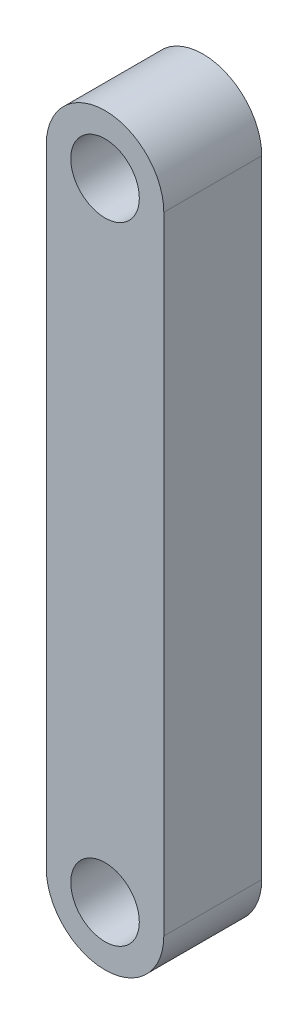
ISO-10303-21;
HEADER;
FILE_DESCRIPTION(('STEP AP214'),'2;1');
FILE_NAME('part.step','',(''),(''),'','','');
FILE_SCHEMA(('AUTOMOTIVE_DESIGN { 1 0 10303 214 1 1 1 1 }'));
ENDSEC;
DATA;
#1=APPLICATION_CONTEXT('core data for automotive mechanical design processes');
#2=APPLICATION_PROTOCOL_DEFINITION('international standard','automotive_design',2000,#1);
#3=PRODUCT_CONTEXT('',#1,'mechanical');
#4=PRODUCT('Part','Part','',(#3));
#5=PRODUCT_RELATED_PRODUCT_CATEGORY('part','',(#4));
#6=PRODUCT_DEFINITION_FORMATION('','',#4);
#7=PRODUCT_DEFINITION_CONTEXT('part definition',#1,'design');
#8=PRODUCT_DEFINITION('design','',#6,#7);
#9=PRODUCT_DEFINITION_SHAPE('','',#8);
#10=(LENGTH_UNIT() NAMED_UNIT(*) SI_UNIT(.MILLI.,.METRE.));
#11=(NAMED_UNIT(*) PLANE_ANGLE_UNIT() SI_UNIT($,.RADIAN.));
#12=(NAMED_UNIT(*) SI_UNIT($,.STERADIAN.) SOLID_ANGLE_UNIT());
#13=UNCERTAINTY_MEASURE_WITH_UNIT(LENGTH_MEASURE(1.E-05),#10,'distance_accuracy_value','');
#14=(GEOMETRIC_REPRESENTATION_CONTEXT(3) GLOBAL_UNCERTAINTY_ASSIGNED_CONTEXT((#13)) GLOBAL_UNIT_ASSIGNED_CONTEXT((#10,
#11,#12)) REPRESENTATION_CONTEXT('',''));
#15=CARTESIAN_POINT('',(0.,0.,0.));
#16=DIRECTION('',(0.,0.,1.));
#17=DIRECTION('',(1.,0.,0.));
#18=AXIS2_PLACEMENT_3D('',#15,#16,#17);
#19=CARTESIAN_POINT('',(-3.,-16.,2.5));
#20=DIRECTION('',(0.,0.,1.));
#21=DIRECTION('',(1.,0.,0.));
#22=AXIS2_PLACEMENT_3D('',#19,#20,#21);
#23=PLANE('',#22);
#24=CARTESIAN_POINT('',(-3.,-16.,2.5));
#25=DIRECTION('',(0.,0.,1.));
#26=DIRECTION('',(1.,0.,0.));
#27=AXIS2_PLACEMENT_3D('',#24,#25,#26);
#28=CIRCLE('',#27,1.75000000000001);
#29=CARTESIAN_POINT('',(-1.24999999999999,-16.,2.5));
#30=VERTEX_POINT('',#29);
#31=EDGE_CURVE('E97',#30,#30,#28,.T.);
#32=ORIENTED_EDGE('',*,*,#31,.F.);
#33=EDGE_LOOP('',(#32));
#34=FACE_BOUND('',#33,.T.);
#35=CARTESIAN_POINT('',(-3.,-16.,2.5));
#36=DIRECTION('',(0.,0.,1.));
#37=DIRECTION('',(1.,0.,0.));
#38=AXIS2_PLACEMENT_3D('',#35,#36,#37);
#39=CIRCLE('',#38,3.);
#40=CARTESIAN_POINT('',(-6.00000000000001,-16.,2.5));
#41=VERTEX_POINT('',#40);
#42=CARTESIAN_POINT('',(0.,-16.,2.5));
#43=VERTEX_POINT('',#42);
#44=EDGE_CURVE('E82',#41,#43,#39,.T.);
#45=ORIENTED_EDGE('',*,*,#44,.T.);
#46=DIRECTION('',(0.,1.,0.));
#47=VECTOR('',#46,1.);
#48=CARTESIAN_POINT('',(0.,16.,2.5));
#49=LINE('',#48,#47);
#50=CARTESIAN_POINT('',(0.,16.,2.5));
#51=VERTEX_POINT('',#50);
#52=EDGE_CURVE('E77',#43,#51,#49,.T.);
#53=ORIENTED_EDGE('',*,*,#52,.T.);
#54=CARTESIAN_POINT('',(-3.,16.,2.5));
#55=DIRECTION('',(0.,0.,1.));
#56=DIRECTION('',(1.,0.,0.));
#57=AXIS2_PLACEMENT_3D('',#54,#55,#56);
#58=CIRCLE('',#57,3.);
#59=CARTESIAN_POINT('',(-6.00000000000001,16.,2.5));
#60=VERTEX_POINT('',#59);
#61=EDGE_CURVE('E80',#51,#60,#58,.T.);
#62=ORIENTED_EDGE('',*,*,#61,.T.);
#63=DIRECTION('',(0.,-1.,0.));
#64=VECTOR('',#63,1.);
#65=CARTESIAN_POINT('',(-6.00000000000001,-16.,2.5));
#66=LINE('',#65,#64);
#67=EDGE_CURVE('E47',#60,#41,#66,.T.);
#68=ORIENTED_EDGE('',*,*,#67,.T.);
#69=EDGE_LOOP('',(#45,#53,#62,#68));
#70=FACE_BOUND('',#69,.T.);
#71=CARTESIAN_POINT('',(-3.,16.,2.5));
#72=DIRECTION('',(0.,0.,1.));
#73=DIRECTION('',(1.,0.,0.));
#74=AXIS2_PLACEMENT_3D('',#71,#72,#73);
#75=CIRCLE('',#74,1.75);
#76=CARTESIAN_POINT('',(-1.25000000000001,16.,2.5));
#77=VERTEX_POINT('',#76);
#78=EDGE_CURVE('E112',#77,#77,#75,.T.);
#79=ORIENTED_EDGE('',*,*,#78,.F.);
#80=EDGE_LOOP('',(#79));
#81=FACE_BOUND('',#80,.T.);
#82=ADVANCED_FACE('F30',(#34,#70,#81),#23,.T.);
#83=CARTESIAN_POINT('',(-3.,-16.,-2.5));
#84=DIRECTION('',(0.,0.,1.));
#85=DIRECTION('',(1.,0.,0.));
#86=AXIS2_PLACEMENT_3D('',#83,#84,#85);
#87=PLANE('',#86);
#88=CARTESIAN_POINT('',(-3.,-16.,-2.5));
#89=DIRECTION('',(0.,0.,1.));
#90=DIRECTION('',(1.,0.,0.));
#91=AXIS2_PLACEMENT_3D('',#88,#89,#90);
#92=CIRCLE('',#91,1.75000000000001);
#93=CARTESIAN_POINT('',(-1.24999999999999,-16.,-2.5));
#94=VERTEX_POINT('',#93);
#95=EDGE_CURVE('E109',#94,#94,#92,.T.);
#96=ORIENTED_EDGE('',*,*,#95,.T.);
#97=EDGE_LOOP('',(#96));
#98=FACE_BOUND('',#97,.T.);
#99=CARTESIAN_POINT('',(-3.,-16.,-2.5));
#100=DIRECTION('',(0.,0.,1.));
#101=DIRECTION('',(1.,0.,0.));
#102=AXIS2_PLACEMENT_3D('',#99,#100,#101);
#103=CIRCLE('',#102,3.);
#104=CARTESIAN_POINT('',(-6.00000000000001,-16.,-2.5));
#105=VERTEX_POINT('',#104);
#106=CARTESIAN_POINT('',(0.,-16.,-2.5));
#107=VERTEX_POINT('',#106);
#108=EDGE_CURVE('E94',#105,#107,#103,.T.);
#109=ORIENTED_EDGE('',*,*,#108,.F.);
#110=DIRECTION('',(0.,-1.,0.));
#111=VECTOR('',#110,1.);
#112=CARTESIAN_POINT('',(-6.00000000000001,-16.,-2.5));
#113=LINE('',#112,#111);
#114=CARTESIAN_POINT('',(-6.00000000000001,16.,-2.5));
#115=VERTEX_POINT('',#114);
#116=EDGE_CURVE('E70',#115,#105,#113,.T.);
#117=ORIENTED_EDGE('',*,*,#116,.F.);
#118=CARTESIAN_POINT('',(-3.,16.,-2.5));
#119=DIRECTION('',(0.,0.,1.));
#120=DIRECTION('',(1.,0.,0.));
#121=AXIS2_PLACEMENT_3D('',#118,#119,#120);
#122=CIRCLE('',#121,3.);
#123=CARTESIAN_POINT('',(0.,16.,-2.5));
#124=VERTEX_POINT('',#123);
#125=EDGE_CURVE('E64',#124,#115,#122,.T.);
#126=ORIENTED_EDGE('',*,*,#125,.F.);
#127=DIRECTION('',(0.,1.,0.));
#128=VECTOR('',#127,1.);
#129=CARTESIAN_POINT('',(0.,16.,-2.5));
#130=LINE('',#129,#128);
#131=EDGE_CURVE('E86',#107,#124,#130,.T.);
#132=ORIENTED_EDGE('',*,*,#131,.F.);
#133=EDGE_LOOP('',(#109,#117,#126,#132));
#134=FACE_BOUND('',#133,.T.);
#135=CARTESIAN_POINT('',(-3.,16.,-2.5));
#136=DIRECTION('',(0.,0.,1.));
#137=DIRECTION('',(1.,0.,0.));
#138=AXIS2_PLACEMENT_3D('',#135,#136,#137);
#139=CIRCLE('',#138,1.75);
#140=CARTESIAN_POINT('',(-1.25000000000001,16.,-2.5));
#141=VERTEX_POINT('',#140);
#142=EDGE_CURVE('E115',#141,#141,#139,.T.);
#143=ORIENTED_EDGE('',*,*,#142,.T.);
#144=EDGE_LOOP('',(#143));
#145=FACE_BOUND('',#144,.T.);
#146=ADVANCED_FACE('F105',(#98,#134,#145),#87,.F.);
#147=CARTESIAN_POINT('',(-3.,-16.,2.5));
#148=DIRECTION('',(0.,0.,-1.));
#149=DIRECTION('',(-1.,0.,0.));
#150=AXIS2_PLACEMENT_3D('',#147,#148,#149);
#151=CYLINDRICAL_SURFACE('',#150,3.);
#152=ORIENTED_EDGE('',*,*,#108,.T.);
#153=DIRECTION('',(0.,0.,-1.));
#154=VECTOR('',#153,1.);
#155=CARTESIAN_POINT('',(0.,-16.,2.5));
#156=LINE('',#155,#154);
#157=EDGE_CURVE('E11',#43,#107,#156,.T.);
#158=ORIENTED_EDGE('',*,*,#157,.F.);
#159=ORIENTED_EDGE('',*,*,#44,.F.);
#160=DIRECTION('',(0.,0.,-1.));
#161=VECTOR('',#160,1.);
#162=CARTESIAN_POINT('',(-6.00000000000001,-16.,2.5));
#163=LINE('',#162,#161);
#164=EDGE_CURVE('E90',#41,#105,#163,.T.);
#165=ORIENTED_EDGE('',*,*,#164,.T.);
#166=EDGE_LOOP('',(#152,#158,#159,#165));
#167=FACE_BOUND('',#166,.T.);
#168=ADVANCED_FACE('F32',(#167),#151,.T.);
#169=CARTESIAN_POINT('',(0.,16.,2.5));
#170=DIRECTION('',(-1.,0.,0.));
#171=DIRECTION('',(0.,0.,1.));
#172=AXIS2_PLACEMENT_3D('',#169,#170,#171);
#173=PLANE('',#172);
#174=ORIENTED_EDGE('',*,*,#131,.T.);
#175=DIRECTION('',(0.,0.,-1.));
#176=VECTOR('',#175,1.);
#177=CARTESIAN_POINT('',(0.,16.,2.5));
#178=LINE('',#177,#176);
#179=EDGE_CURVE('E39',#51,#124,#178,.T.);
#180=ORIENTED_EDGE('',*,*,#179,.F.);
#181=ORIENTED_EDGE('',*,*,#52,.F.);
#182=ORIENTED_EDGE('',*,*,#157,.T.);
#183=EDGE_LOOP('',(#174,#180,#181,#182));
#184=FACE_BOUND('',#183,.T.);
#185=ADVANCED_FACE('F85',(#184),#173,.F.);
#186=CARTESIAN_POINT('',(-3.,16.,2.5));
#187=DIRECTION('',(0.,0.,-1.));
#188=DIRECTION('',(-1.,0.,0.));
#189=AXIS2_PLACEMENT_3D('',#186,#187,#188);
#190=CYLINDRICAL_SURFACE('',#189,3.);
#191=ORIENTED_EDGE('',*,*,#125,.T.);
#192=DIRECTION('',(0.,0.,-1.));
#193=VECTOR('',#192,1.);
#194=CARTESIAN_POINT('',(-6.00000000000001,16.,2.5));
#195=LINE('',#194,#193);
#196=EDGE_CURVE('E87',#60,#115,#195,.T.);
#197=ORIENTED_EDGE('',*,*,#196,.F.);
#198=ORIENTED_EDGE('',*,*,#61,.F.);
#199=ORIENTED_EDGE('',*,*,#179,.T.);
#200=EDGE_LOOP('',(#191,#197,#198,#199));
#201=FACE_BOUND('',#200,.T.);
#202=ADVANCED_FACE('F88',(#201),#190,.T.);
#203=CARTESIAN_POINT('',(-6.00000000000001,-16.,2.5));
#204=DIRECTION('',(1.,0.,0.));
#205=DIRECTION('',(0.,0.,-1.));
#206=AXIS2_PLACEMENT_3D('',#203,#204,#205);
#207=PLANE('',#206);
#208=ORIENTED_EDGE('',*,*,#116,.T.);
#209=ORIENTED_EDGE('',*,*,#164,.F.);
#210=ORIENTED_EDGE('',*,*,#67,.F.);
#211=ORIENTED_EDGE('',*,*,#196,.T.);
#212=EDGE_LOOP('',(#208,#209,#210,#211));
#213=FACE_BOUND('',#212,.T.);
#214=ADVANCED_FACE('F102',(#213),#207,.F.);
#215=CARTESIAN_POINT('',(-3.,-16.,2.5));
#216=DIRECTION('',(0.,0.,-1.));
#217=DIRECTION('',(-1.,0.,0.));
#218=AXIS2_PLACEMENT_3D('',#215,#216,#217);
#219=CYLINDRICAL_SURFACE('',#218,1.75000000000001);
#220=ORIENTED_EDGE('',*,*,#31,.T.);
#221=EDGE_LOOP('',(#220));
#222=FACE_BOUND('',#221,.T.);
#223=ORIENTED_EDGE('',*,*,#95,.F.);
#224=EDGE_LOOP('',(#223));
#225=FACE_BOUND('',#224,.T.);
#226=ADVANCED_FACE('F133',(#222,#225),#219,.F.);
#227=CARTESIAN_POINT('',(-3.,16.,2.5));
#228=DIRECTION('',(0.,0.,-1.));
#229=DIRECTION('',(-1.,0.,0.));
#230=AXIS2_PLACEMENT_3D('',#227,#228,#229);
#231=CYLINDRICAL_SURFACE('',#230,1.75);
#232=ORIENTED_EDGE('',*,*,#78,.T.);
#233=EDGE_LOOP('',(#232));
#234=FACE_BOUND('',#233,.T.);
#235=ORIENTED_EDGE('',*,*,#142,.F.);
#236=EDGE_LOOP('',(#235));
#237=FACE_BOUND('',#236,.T.);
#238=ADVANCED_FACE('F121',(#234,#237),#231,.F.);
#239=CLOSED_SHELL('',(#82,#146,#168,#185,#202,#214,#226,#238));
#240=MANIFOLD_SOLID_BREP('B2',#239);
#241=ADVANCED_BREP_SHAPE_REPRESENTATION('',(#18,#240),#14);
#242=SHAPE_DEFINITION_REPRESENTATION(#9,#241);
ENDSEC;
END-ISO-10303-21;
